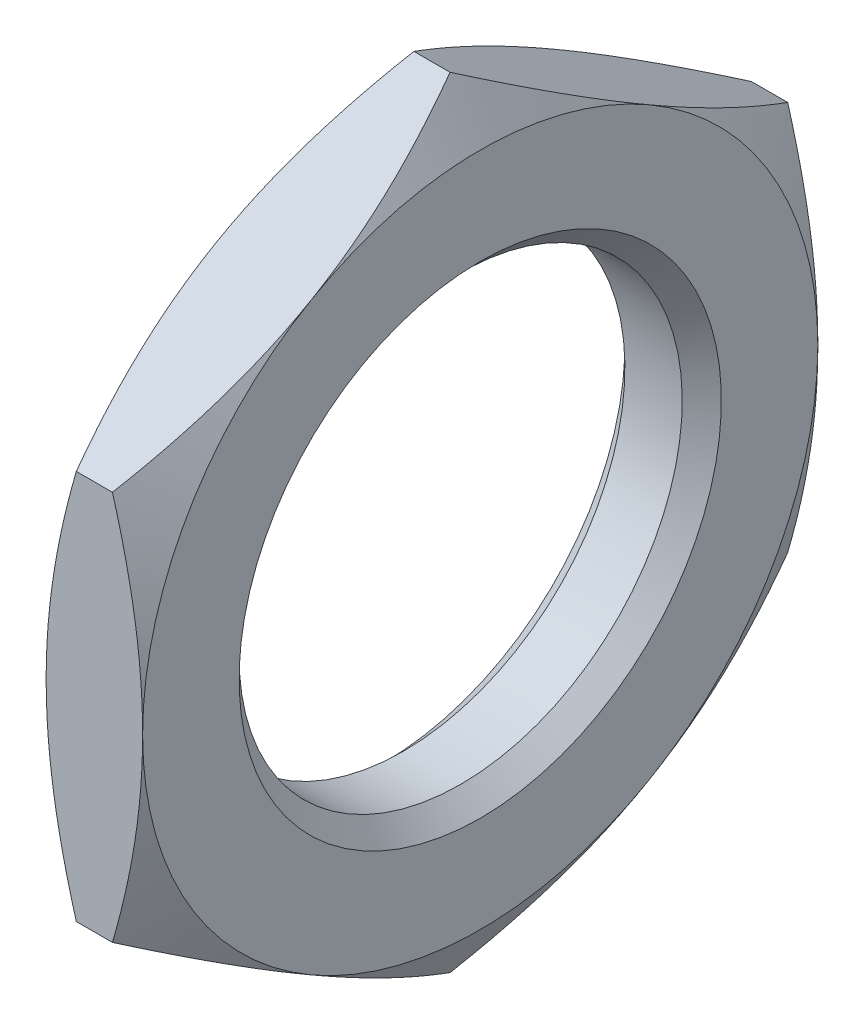
ISO-10303-21;
HEADER;
FILE_DESCRIPTION(('STEP AP214'),'2;1');
FILE_NAME('part.step','',(''),(''),'','','');
FILE_SCHEMA(('AUTOMOTIVE_DESIGN { 1 0 10303 214 1 1 1 1 }'));
ENDSEC;
DATA;
#1=APPLICATION_CONTEXT('core data for automotive mechanical design processes');
#2=APPLICATION_PROTOCOL_DEFINITION('international standard','automotive_design',2000,#1);
#3=PRODUCT_CONTEXT('',#1,'mechanical');
#4=PRODUCT('Part','Part','',(#3));
#5=PRODUCT_RELATED_PRODUCT_CATEGORY('part','',(#4));
#6=PRODUCT_DEFINITION_FORMATION('','',#4);
#7=PRODUCT_DEFINITION_CONTEXT('part definition',#1,'design');
#8=PRODUCT_DEFINITION('design','',#6,#7);
#9=PRODUCT_DEFINITION_SHAPE('','',#8);
#10=(LENGTH_UNIT() NAMED_UNIT(*) SI_UNIT(.MILLI.,.METRE.));
#11=(NAMED_UNIT(*) PLANE_ANGLE_UNIT() SI_UNIT($,.RADIAN.));
#12=(NAMED_UNIT(*) SI_UNIT($,.STERADIAN.) SOLID_ANGLE_UNIT());
#13=UNCERTAINTY_MEASURE_WITH_UNIT(LENGTH_MEASURE(1.E-05),#10,'distance_accuracy_value','');
#14=(GEOMETRIC_REPRESENTATION_CONTEXT(3) GLOBAL_UNCERTAINTY_ASSIGNED_CONTEXT((#13)) GLOBAL_UNIT_ASSIGNED_CONTEXT((#10,
#11,#12)) REPRESENTATION_CONTEXT('',''));
#15=CARTESIAN_POINT('',(0.,0.,0.));
#16=DIRECTION('',(0.,0.,1.));
#17=DIRECTION('',(1.,0.,0.));
#18=AXIS2_PLACEMENT_3D('',#15,#16,#17);
#19=CARTESIAN_POINT('',(-1.,-6.06217782649107,-3.5));
#20=DIRECTION('',(0.,-0.866025403784439,-0.5));
#21=DIRECTION('',(0.,0.5,-0.866025403784439));
#22=AXIS2_PLACEMENT_3D('',#19,#20,#21);
#23=PLANE('',#22);
#24=CARTESIAN_POINT('',(0.626425042070744,-4.03935646759652,-7.00362936824088));
#25=CARTESIAN_POINT('',(0.,-5.1235136228277,-5.12581409199112));
#26=CARTESIAN_POINT('',(0.,-6.06217782649107,-3.5));
#27=CARTESIAN_POINT('',(0.,-7.00084203015444,-1.87418590800888));
#28=CARTESIAN_POINT('',(0.626425042070745,-8.08499918538562,0.00362936824088389));
#29=(BOUNDED_CURVE() B_SPLINE_CURVE(2,(#24,#25,#26,#27,#28),.UNSPECIFIED.,.F.,
.F.) B_SPLINE_CURVE_WITH_KNOTS((3,2,3),(0.,4.10432147825994,8.20864295651988),
.UNSPECIFIED.) CURVE() GEOMETRIC_REPRESENTATION_ITEM() RATIONAL_B_SPLINE_CURVE((1.,
1.03802697460134,1.,1.03802697460135,1.)) REPRESENTATION_ITEM(''));
#30=CARTESIAN_POINT('',(0.625214782339285,-4.04145188432738,-7.));
#31=VERTEX_POINT('',#30);
#32=CARTESIAN_POINT('',(0.,-6.06217782649107,-3.5));
#33=VERTEX_POINT('',#32);
#34=EDGE_CURVE('E195',#31,#33,#29,.T.);
#35=ORIENTED_EDGE('',*,*,#34,.F.);
#36=DIRECTION('',(1.,0.,0.));
#37=VECTOR('',#36,1.);
#38=CARTESIAN_POINT('',(-1.,-4.04145188432738,-7.));
#39=LINE('',#38,#37);
#40=CARTESIAN_POINT('',(1.37478521766071,-4.04145188432738,-7.));
#41=VERTEX_POINT('',#40);
#42=EDGE_CURVE('E11',#31,#41,#39,.T.);
#43=ORIENTED_EDGE('',*,*,#42,.T.);
#44=CARTESIAN_POINT('',(1.37357495792926,-8.08499918538562,0.00362936824088389));
#45=CARTESIAN_POINT('',(2.,-7.00084203015444,-1.87418590800888));
#46=CARTESIAN_POINT('',(2.,-6.06217782649107,-3.5));
#47=CARTESIAN_POINT('',(2.,-5.12351362282771,-5.12581409199112));
#48=CARTESIAN_POINT('',(1.37357495792926,-4.03935646759652,-7.00362936824088));
#49=(BOUNDED_CURVE() B_SPLINE_CURVE(2,(#44,#45,#46,#47,#48),.UNSPECIFIED.,.F.,
.F.) B_SPLINE_CURVE_WITH_KNOTS((3,2,3),(0.,4.10432147825994,8.20864295651988),
.UNSPECIFIED.) CURVE() GEOMETRIC_REPRESENTATION_ITEM() RATIONAL_B_SPLINE_CURVE((1.,
1.03802697460135,1.,1.03802697460134,1.)) REPRESENTATION_ITEM(''));
#50=CARTESIAN_POINT('',(2.,-6.06217782649107,-3.5));
#51=VERTEX_POINT('',#50);
#52=EDGE_CURVE('E132',#51,#41,#49,.T.);
#53=ORIENTED_EDGE('',*,*,#52,.F.);
#54=CARTESIAN_POINT('',(1.37357495792926,-8.08499918538562,0.00362936824088389));
#55=CARTESIAN_POINT('',(2.,-7.00084203015444,-1.87418590800888));
#56=CARTESIAN_POINT('',(2.,-6.06217782649107,-3.5));
#57=CARTESIAN_POINT('',(2.,-5.12351362282771,-5.12581409199112));
#58=CARTESIAN_POINT('',(1.37357495792926,-4.03935646759652,-7.00362936824088));
#59=(BOUNDED_CURVE() B_SPLINE_CURVE(2,(#54,#55,#56,#57,#58),.UNSPECIFIED.,.F.,
.F.) B_SPLINE_CURVE_WITH_KNOTS((3,2,3),(0.,4.10432147825994,8.20864295651988),
.UNSPECIFIED.) CURVE() GEOMETRIC_REPRESENTATION_ITEM() RATIONAL_B_SPLINE_CURVE((1.,
1.03802697460135,1.,1.03802697460134,1.)) REPRESENTATION_ITEM(''));
#60=CARTESIAN_POINT('',(1.37478521766071,-8.08290376865476,0.));
#61=VERTEX_POINT('',#60);
#62=EDGE_CURVE('E156',#61,#51,#59,.T.);
#63=ORIENTED_EDGE('',*,*,#62,.F.);
#64=DIRECTION('',(1.,0.,0.));
#65=VECTOR('',#64,1.);
#66=CARTESIAN_POINT('',(-1.,-8.08290376865476,0.));
#67=LINE('',#66,#65);
#68=CARTESIAN_POINT('',(0.625214782339286,-8.08290376865476,0.));
#69=VERTEX_POINT('',#68);
#70=EDGE_CURVE('E152',#69,#61,#67,.T.);
#71=ORIENTED_EDGE('',*,*,#70,.F.);
#72=CARTESIAN_POINT('',(0.626425042070744,-4.03935646759652,-7.00362936824088));
#73=CARTESIAN_POINT('',(0.,-5.1235136228277,-5.12581409199112));
#74=CARTESIAN_POINT('',(0.,-6.06217782649107,-3.5));
#75=CARTESIAN_POINT('',(0.,-7.00084203015444,-1.87418590800888));
#76=CARTESIAN_POINT('',(0.626425042070745,-8.08499918538562,0.00362936824088389));
#77=(BOUNDED_CURVE() B_SPLINE_CURVE(2,(#72,#73,#74,#75,#76),.UNSPECIFIED.,.F.,
.F.) B_SPLINE_CURVE_WITH_KNOTS((3,2,3),(0.,4.10432147825994,8.20864295651988),
.UNSPECIFIED.) CURVE() GEOMETRIC_REPRESENTATION_ITEM() RATIONAL_B_SPLINE_CURVE((1.,
1.03802697460134,1.,1.03802697460135,1.)) REPRESENTATION_ITEM(''));
#78=EDGE_CURVE('E205',#33,#69,#77,.T.);
#79=ORIENTED_EDGE('',*,*,#78,.F.);
#80=EDGE_LOOP('',(#35,#43,#53,#63,#71,#79));
#81=FACE_BOUND('',#80,.T.);
#82=ADVANCED_FACE('F16',(#81),#23,.T.);
#83=CARTESIAN_POINT('',(-1.,0.,-7.));
#84=DIRECTION('',(0.,0.,-1.));
#85=DIRECTION('',(0.,1.,0.));
#86=AXIS2_PLACEMENT_3D('',#83,#84,#85);
#87=PLANE('',#86);
#88=CARTESIAN_POINT('',(0.626425042070744,4.04564271778911,-7.));
#89=CARTESIAN_POINT('',(0.,1.87732840732673,-7.));
#90=CARTESIAN_POINT('',(0.,0.,-7.));
#91=CARTESIAN_POINT('',(0.,-1.87732840732673,-7.));
#92=CARTESIAN_POINT('',(0.626425042070744,-4.04564271778911,-7.));
#93=(BOUNDED_CURVE() B_SPLINE_CURVE(2,(#88,#89,#90,#91,#92),.UNSPECIFIED.,.F.,
.F.) B_SPLINE_CURVE_WITH_KNOTS((3,2,3),(0.,4.10432147825995,8.20864295651989),
.UNSPECIFIED.) CURVE() GEOMETRIC_REPRESENTATION_ITEM() RATIONAL_B_SPLINE_CURVE((1.,
1.03802697460135,1.,1.03802697460135,1.)) REPRESENTATION_ITEM(''));
#94=CARTESIAN_POINT('',(0.625214782339284,4.04145188432738,-7.));
#95=VERTEX_POINT('',#94);
#96=CARTESIAN_POINT('',(0.,0.,-7.));
#97=VERTEX_POINT('',#96);
#98=EDGE_CURVE('E186',#95,#97,#93,.T.);
#99=ORIENTED_EDGE('',*,*,#98,.F.);
#100=DIRECTION('',(1.,0.,0.));
#101=VECTOR('',#100,1.);
#102=CARTESIAN_POINT('',(-1.,4.04145188432738,-7.));
#103=LINE('',#102,#101);
#104=CARTESIAN_POINT('',(1.37478521766072,4.04145188432738,-7.));
#105=VERTEX_POINT('',#104);
#106=EDGE_CURVE('E26',#95,#105,#103,.T.);
#107=ORIENTED_EDGE('',*,*,#106,.T.);
#108=CARTESIAN_POINT('',(1.37357495792926,-4.04564271778911,-7.));
#109=CARTESIAN_POINT('',(2.,-1.87732840732674,-7.));
#110=CARTESIAN_POINT('',(2.,0.,-7.));
#111=CARTESIAN_POINT('',(2.,1.87732840732674,-7.));
#112=CARTESIAN_POINT('',(1.37357495792926,4.04564271778911,-7.));
#113=(BOUNDED_CURVE() B_SPLINE_CURVE(2,(#108,#109,#110,#111,#112),.UNSPECIFIED.,.F.,
.F.) B_SPLINE_CURVE_WITH_KNOTS((3,2,3),(0.,4.10432147825995,8.20864295651989),
.UNSPECIFIED.) CURVE() GEOMETRIC_REPRESENTATION_ITEM() RATIONAL_B_SPLINE_CURVE((1.,
1.03802697460134,1.,1.03802697460134,1.)) REPRESENTATION_ITEM(''));
#114=CARTESIAN_POINT('',(2.,0.,-7.));
#115=VERTEX_POINT('',#114);
#116=EDGE_CURVE('E136',#115,#105,#113,.T.);
#117=ORIENTED_EDGE('',*,*,#116,.F.);
#118=CARTESIAN_POINT('',(1.37357495792926,-4.04564271778911,-7.));
#119=CARTESIAN_POINT('',(2.,-1.87732840732674,-7.));
#120=CARTESIAN_POINT('',(2.,0.,-7.));
#121=CARTESIAN_POINT('',(2.,1.87732840732674,-7.));
#122=CARTESIAN_POINT('',(1.37357495792926,4.04564271778911,-7.));
#123=(BOUNDED_CURVE() B_SPLINE_CURVE(2,(#118,#119,#120,#121,#122),.UNSPECIFIED.,.F.,
.F.) B_SPLINE_CURVE_WITH_KNOTS((3,2,3),(0.,4.10432147825995,8.20864295651989),
.UNSPECIFIED.) CURVE() GEOMETRIC_REPRESENTATION_ITEM() RATIONAL_B_SPLINE_CURVE((1.,
1.03802697460134,1.,1.03802697460134,1.)) REPRESENTATION_ITEM(''));
#124=EDGE_CURVE('E127',#41,#115,#123,.T.);
#125=ORIENTED_EDGE('',*,*,#124,.F.);
#126=ORIENTED_EDGE('',*,*,#42,.F.);
#127=CARTESIAN_POINT('',(0.626425042070744,4.04564271778911,-7.));
#128=CARTESIAN_POINT('',(0.,1.87732840732673,-7.));
#129=CARTESIAN_POINT('',(0.,0.,-7.));
#130=CARTESIAN_POINT('',(0.,-1.87732840732673,-7.));
#131=CARTESIAN_POINT('',(0.626425042070744,-4.04564271778911,-7.));
#132=(BOUNDED_CURVE() B_SPLINE_CURVE(2,(#127,#128,#129,#130,#131),.UNSPECIFIED.,.F.,
.F.) B_SPLINE_CURVE_WITH_KNOTS((3,2,3),(0.,4.10432147825995,8.20864295651989),
.UNSPECIFIED.) CURVE() GEOMETRIC_REPRESENTATION_ITEM() RATIONAL_B_SPLINE_CURVE((1.,
1.03802697460135,1.,1.03802697460135,1.)) REPRESENTATION_ITEM(''));
#133=EDGE_CURVE('E187',#97,#31,#132,.T.);
#134=ORIENTED_EDGE('',*,*,#133,.F.);
#135=EDGE_LOOP('',(#99,#107,#117,#125,#126,#134));
#136=FACE_BOUND('',#135,.T.);
#137=ADVANCED_FACE('F138',(#136),#87,.T.);
#138=CARTESIAN_POINT('',(-1.,6.06217782649107,-3.5));
#139=DIRECTION('',(0.,0.866025403784439,-0.5));
#140=DIRECTION('',(0.,0.5,0.866025403784439));
#141=AXIS2_PLACEMENT_3D('',#138,#139,#140);
#142=PLANE('',#141);
#143=CARTESIAN_POINT('',(0.626425042070744,8.08499918538562,0.00362936824088104));
#144=CARTESIAN_POINT('',(0.,7.00084203015444,-1.87418590800888));
#145=CARTESIAN_POINT('',(0.,6.06217782649107,-3.5));
#146=CARTESIAN_POINT('',(0.,5.1235136228277,-5.12581409199113));
#147=CARTESIAN_POINT('',(0.626425042070744,4.03935646759652,-7.00362936824089));
#148=(BOUNDED_CURVE() B_SPLINE_CURVE(2,(#143,#144,#145,#146,#147),.UNSPECIFIED.,.F.,
.F.) B_SPLINE_CURVE_WITH_KNOTS((3,2,3),(0.,4.10432147825994,8.20864295651988),
.UNSPECIFIED.) CURVE() GEOMETRIC_REPRESENTATION_ITEM() RATIONAL_B_SPLINE_CURVE((1.,
1.03802697460134,1.,1.03802697460133,1.)) REPRESENTATION_ITEM(''));
#149=CARTESIAN_POINT('',(0.625214782339285,8.08290376865476,0.));
#150=VERTEX_POINT('',#149);
#151=CARTESIAN_POINT('',(0.,6.06217782649107,-3.5));
#152=VERTEX_POINT('',#151);
#153=EDGE_CURVE('E180',#150,#152,#148,.T.);
#154=ORIENTED_EDGE('',*,*,#153,.F.);
#155=DIRECTION('',(1.,0.,0.));
#156=VECTOR('',#155,1.);
#157=CARTESIAN_POINT('',(-1.,8.08290376865476,0.));
#158=LINE('',#157,#156);
#159=CARTESIAN_POINT('',(1.37478521766071,8.08290376865476,0.));
#160=VERTEX_POINT('',#159);
#161=EDGE_CURVE('E150',#150,#160,#158,.T.);
#162=ORIENTED_EDGE('',*,*,#161,.T.);
#163=CARTESIAN_POINT('',(1.37357495792926,4.03935646759652,-7.00362936824088));
#164=CARTESIAN_POINT('',(2.,5.1235136228277,-5.12581409199112));
#165=CARTESIAN_POINT('',(2.,6.06217782649107,-3.5));
#166=CARTESIAN_POINT('',(2.,7.00084203015442,-1.87418590800887));
#167=CARTESIAN_POINT('',(1.37357495792926,8.08499918538562,0.00362936824088056));
#168=(BOUNDED_CURVE() B_SPLINE_CURVE(2,(#163,#164,#165,#166,#167),.UNSPECIFIED.,.F.,
.F.) B_SPLINE_CURVE_WITH_KNOTS((3,2,3),(0.,4.10432147825994,8.20864295651988),
.UNSPECIFIED.) CURVE() GEOMETRIC_REPRESENTATION_ITEM() RATIONAL_B_SPLINE_CURVE((1.,
1.03802697460133,1.,1.03802697460134,1.)) REPRESENTATION_ITEM(''));
#169=CARTESIAN_POINT('',(2.,6.06217782649107,-3.5));
#170=VERTEX_POINT('',#169);
#171=EDGE_CURVE('E349',#170,#160,#168,.T.);
#172=ORIENTED_EDGE('',*,*,#171,.F.);
#173=CARTESIAN_POINT('',(1.37357495792926,4.03935646759652,-7.00362936824088));
#174=CARTESIAN_POINT('',(2.,5.1235136228277,-5.12581409199112));
#175=CARTESIAN_POINT('',(2.,6.06217782649107,-3.5));
#176=CARTESIAN_POINT('',(2.,7.00084203015442,-1.87418590800887));
#177=CARTESIAN_POINT('',(1.37357495792926,8.08499918538562,0.00362936824088056));
#178=(BOUNDED_CURVE() B_SPLINE_CURVE(2,(#173,#174,#175,#176,#177),.UNSPECIFIED.,.F.,
.F.) B_SPLINE_CURVE_WITH_KNOTS((3,2,3),(0.,4.10432147825994,8.20864295651988),
.UNSPECIFIED.) CURVE() GEOMETRIC_REPRESENTATION_ITEM() RATIONAL_B_SPLINE_CURVE((1.,
1.03802697460133,1.,1.03802697460134,1.)) REPRESENTATION_ITEM(''));
#179=EDGE_CURVE('E144',#105,#170,#178,.T.);
#180=ORIENTED_EDGE('',*,*,#179,.F.);
#181=ORIENTED_EDGE('',*,*,#106,.F.);
#182=CARTESIAN_POINT('',(0.626425042070744,8.08499918538562,0.00362936824088104));
#183=CARTESIAN_POINT('',(0.,7.00084203015444,-1.87418590800888));
#184=CARTESIAN_POINT('',(0.,6.06217782649107,-3.5));
#185=CARTESIAN_POINT('',(0.,5.1235136228277,-5.12581409199113));
#186=CARTESIAN_POINT('',(0.626425042070744,4.03935646759652,-7.00362936824089));
#187=(BOUNDED_CURVE() B_SPLINE_CURVE(2,(#182,#183,#184,#185,#186),.UNSPECIFIED.,.F.,
.F.) B_SPLINE_CURVE_WITH_KNOTS((3,2,3),(0.,4.10432147825994,8.20864295651988),
.UNSPECIFIED.) CURVE() GEOMETRIC_REPRESENTATION_ITEM() RATIONAL_B_SPLINE_CURVE((1.,
1.03802697460134,1.,1.03802697460133,1.)) REPRESENTATION_ITEM(''));
#188=EDGE_CURVE('E181',#152,#95,#187,.T.);
#189=ORIENTED_EDGE('',*,*,#188,.F.);
#190=EDGE_LOOP('',(#154,#162,#172,#180,#181,#189));
#191=FACE_BOUND('',#190,.T.);
#192=ADVANCED_FACE('F291',(#191),#142,.T.);
#193=CARTESIAN_POINT('',(-1.,-6.06217782649107,3.5));
#194=DIRECTION('',(0.,-0.866025403784439,0.5));
#195=DIRECTION('',(0.,-0.5,-0.866025403784439));
#196=AXIS2_PLACEMENT_3D('',#193,#194,#195);
#197=PLANE('',#196);
#198=CARTESIAN_POINT('',(0.626425042070745,-8.08499918538562,-0.00362936824088437));
#199=CARTESIAN_POINT('',(0.,-7.00084203015444,1.87418590800886));
#200=CARTESIAN_POINT('',(0.,-6.06217782649107,3.5));
#201=CARTESIAN_POINT('',(0.,-5.1235136228277,5.12581409199113));
#202=CARTESIAN_POINT('',(0.626425042070744,-4.03935646759652,7.00362936824088));
#203=(BOUNDED_CURVE() B_SPLINE_CURVE(2,(#198,#199,#200,#201,#202),.UNSPECIFIED.,.F.,
.F.) B_SPLINE_CURVE_WITH_KNOTS((3,2,3),(0.,4.10432147825994,8.20864295651988),
.UNSPECIFIED.) CURVE() GEOMETRIC_REPRESENTATION_ITEM() RATIONAL_B_SPLINE_CURVE((1.,
1.03802697460134,1.,1.03802697460133,1.)) REPRESENTATION_ITEM(''));
#204=CARTESIAN_POINT('',(0.,-6.06217782649107,3.5));
#205=VERTEX_POINT('',#204);
#206=CARTESIAN_POINT('',(0.625214782339285,-4.04145188432738,7.));
#207=VERTEX_POINT('',#206);
#208=EDGE_CURVE('E163',#205,#207,#203,.T.);
#209=ORIENTED_EDGE('',*,*,#208,.F.);
#210=CARTESIAN_POINT('',(0.626425042070745,-8.08499918538562,-0.00362936824088437));
#211=CARTESIAN_POINT('',(0.,-7.00084203015444,1.87418590800886));
#212=CARTESIAN_POINT('',(0.,-6.06217782649107,3.5));
#213=CARTESIAN_POINT('',(0.,-5.1235136228277,5.12581409199113));
#214=CARTESIAN_POINT('',(0.626425042070744,-4.03935646759652,7.00362936824088));
#215=(BOUNDED_CURVE() B_SPLINE_CURVE(2,(#210,#211,#212,#213,#214),.UNSPECIFIED.,.F.,
.F.) B_SPLINE_CURVE_WITH_KNOTS((3,2,3),(0.,4.10432147825994,8.20864295651988),
.UNSPECIFIED.) CURVE() GEOMETRIC_REPRESENTATION_ITEM() RATIONAL_B_SPLINE_CURVE((1.,
1.03802697460134,1.,1.03802697460133,1.)) REPRESENTATION_ITEM(''));
#216=EDGE_CURVE('E197',#69,#205,#215,.T.);
#217=ORIENTED_EDGE('',*,*,#216,.F.);
#218=ORIENTED_EDGE('',*,*,#70,.T.);
#219=CARTESIAN_POINT('',(1.37357495792926,-4.03935646759652,7.00362936824089));
#220=CARTESIAN_POINT('',(2.,-5.12351362282771,5.12581409199113));
#221=CARTESIAN_POINT('',(2.,-6.06217782649107,3.5));
#222=CARTESIAN_POINT('',(2.,-7.00084203015443,1.87418590800887));
#223=CARTESIAN_POINT('',(1.37357495792926,-8.08499918538562,-0.00362936824088533));
#224=(BOUNDED_CURVE() B_SPLINE_CURVE(2,(#219,#220,#221,#222,#223),.UNSPECIFIED.,.F.,
.F.) B_SPLINE_CURVE_WITH_KNOTS((3,2,3),(0.,4.10432147825995,8.20864295651989),
.UNSPECIFIED.) CURVE() GEOMETRIC_REPRESENTATION_ITEM() RATIONAL_B_SPLINE_CURVE((1.,
1.03802697460134,1.,1.03802697460134,1.)) REPRESENTATION_ITEM(''));
#225=CARTESIAN_POINT('',(2.,-6.06217782649107,3.5));
#226=VERTEX_POINT('',#225);
#227=EDGE_CURVE('E249',#226,#61,#224,.T.);
#228=ORIENTED_EDGE('',*,*,#227,.F.);
#229=CARTESIAN_POINT('',(1.37357495792926,-4.03935646759652,7.00362936824089));
#230=CARTESIAN_POINT('',(2.,-5.12351362282771,5.12581409199113));
#231=CARTESIAN_POINT('',(2.,-6.06217782649107,3.5));
#232=CARTESIAN_POINT('',(2.,-7.00084203015443,1.87418590800887));
#233=CARTESIAN_POINT('',(1.37357495792926,-8.08499918538562,-0.00362936824088533));
#234=(BOUNDED_CURVE() B_SPLINE_CURVE(2,(#229,#230,#231,#232,#233),.UNSPECIFIED.,.F.,
.F.) B_SPLINE_CURVE_WITH_KNOTS((3,2,3),(0.,4.10432147825995,8.20864295651989),
.UNSPECIFIED.) CURVE() GEOMETRIC_REPRESENTATION_ITEM() RATIONAL_B_SPLINE_CURVE((1.,
1.03802697460134,1.,1.03802697460134,1.)) REPRESENTATION_ITEM(''));
#235=CARTESIAN_POINT('',(1.37478521766071,-4.04145188432738,7.));
#236=VERTEX_POINT('',#235);
#237=EDGE_CURVE('E221',#236,#226,#234,.T.);
#238=ORIENTED_EDGE('',*,*,#237,.F.);
#239=DIRECTION('',(1.,0.,0.));
#240=VECTOR('',#239,1.);
#241=CARTESIAN_POINT('',(-1.,-4.04145188432738,7.));
#242=LINE('',#241,#240);
#243=EDGE_CURVE('E154',#207,#236,#242,.T.);
#244=ORIENTED_EDGE('',*,*,#243,.F.);
#245=EDGE_LOOP('',(#209,#217,#218,#228,#238,#244));
#246=FACE_BOUND('',#245,.T.);
#247=ADVANCED_FACE('F393',(#246),#197,.T.);
#248=CARTESIAN_POINT('',(-1.,0.,7.));
#249=DIRECTION('',(0.,0.,1.));
#250=DIRECTION('',(0.,-1.,0.));
#251=AXIS2_PLACEMENT_3D('',#248,#249,#250);
#252=PLANE('',#251);
#253=CARTESIAN_POINT('',(0.626425042070744,-4.04564271778911,7.));
#254=CARTESIAN_POINT('',(0.,-1.87732840732673,7.));
#255=CARTESIAN_POINT('',(0.,0.,7.));
#256=CARTESIAN_POINT('',(0.,1.87732840732673,6.99999999999999));
#257=CARTESIAN_POINT('',(0.626425042070744,4.04564271778911,7.));
#258=(BOUNDED_CURVE() B_SPLINE_CURVE(2,(#253,#254,#255,#256,#257),.UNSPECIFIED.,.F.,
.F.) B_SPLINE_CURVE_WITH_KNOTS((3,2,3),(0.,4.10432147825995,8.20864295651989),
.UNSPECIFIED.) CURVE() GEOMETRIC_REPRESENTATION_ITEM() RATIONAL_B_SPLINE_CURVE((1.,
1.03802697460134,1.,1.03802697460136,1.)) REPRESENTATION_ITEM(''));
#259=CARTESIAN_POINT('',(0.,0.,7.));
#260=VERTEX_POINT('',#259);
#261=CARTESIAN_POINT('',(0.625214782339285,4.04145188432738,7.));
#262=VERTEX_POINT('',#261);
#263=EDGE_CURVE('E268',#260,#262,#258,.T.);
#264=ORIENTED_EDGE('',*,*,#263,.F.);
#265=CARTESIAN_POINT('',(0.626425042070744,-4.04564271778911,7.));
#266=CARTESIAN_POINT('',(0.,-1.87732840732673,7.));
#267=CARTESIAN_POINT('',(0.,0.,7.));
#268=CARTESIAN_POINT('',(0.,1.87732840732673,6.99999999999999));
#269=CARTESIAN_POINT('',(0.626425042070744,4.04564271778911,7.));
#270=(BOUNDED_CURVE() B_SPLINE_CURVE(2,(#265,#266,#267,#268,#269),.UNSPECIFIED.,.F.,
.F.) B_SPLINE_CURVE_WITH_KNOTS((3,2,3),(0.,4.10432147825995,8.20864295651989),
.UNSPECIFIED.) CURVE() GEOMETRIC_REPRESENTATION_ITEM() RATIONAL_B_SPLINE_CURVE((1.,
1.03802697460134,1.,1.03802697460136,1.)) REPRESENTATION_ITEM(''));
#271=EDGE_CURVE('E164',#207,#260,#270,.T.);
#272=ORIENTED_EDGE('',*,*,#271,.F.);
#273=ORIENTED_EDGE('',*,*,#243,.T.);
#274=CARTESIAN_POINT('',(1.37357495792926,4.04564271778911,7.));
#275=CARTESIAN_POINT('',(2.,1.87732840732674,7.));
#276=CARTESIAN_POINT('',(2.,0.,7.));
#277=CARTESIAN_POINT('',(2.,-1.87732840732674,7.));
#278=CARTESIAN_POINT('',(1.37357495792926,-4.04564271778911,7.));
#279=(BOUNDED_CURVE() B_SPLINE_CURVE(2,(#274,#275,#276,#277,#278),.UNSPECIFIED.,.F.,
.F.) B_SPLINE_CURVE_WITH_KNOTS((3,2,3),(0.,4.10432147825995,8.20864295651989),
.UNSPECIFIED.) CURVE() GEOMETRIC_REPRESENTATION_ITEM() RATIONAL_B_SPLINE_CURVE((1.,
1.03802697460135,1.,1.03802697460135,1.)) REPRESENTATION_ITEM(''));
#280=CARTESIAN_POINT('',(2.,0.,7.));
#281=VERTEX_POINT('',#280);
#282=EDGE_CURVE('E213',#281,#236,#279,.T.);
#283=ORIENTED_EDGE('',*,*,#282,.F.);
#284=CARTESIAN_POINT('',(1.37357495792926,4.04564271778911,7.));
#285=CARTESIAN_POINT('',(2.,1.87732840732674,7.));
#286=CARTESIAN_POINT('',(2.,0.,7.));
#287=CARTESIAN_POINT('',(2.,-1.87732840732674,7.));
#288=CARTESIAN_POINT('',(1.37357495792926,-4.04564271778911,7.));
#289=(BOUNDED_CURVE() B_SPLINE_CURVE(2,(#284,#285,#286,#287,#288),.UNSPECIFIED.,.F.,
.F.) B_SPLINE_CURVE_WITH_KNOTS((3,2,3),(0.,4.10432147825995,8.20864295651989),
.UNSPECIFIED.) CURVE() GEOMETRIC_REPRESENTATION_ITEM() RATIONAL_B_SPLINE_CURVE((1.,
1.03802697460135,1.,1.03802697460135,1.)) REPRESENTATION_ITEM(''));
#290=CARTESIAN_POINT('',(1.37478521766071,4.04145188432738,7.));
#291=VERTEX_POINT('',#290);
#292=EDGE_CURVE('E355',#291,#281,#289,.T.);
#293=ORIENTED_EDGE('',*,*,#292,.F.);
#294=DIRECTION('',(1.,0.,0.));
#295=VECTOR('',#294,1.);
#296=CARTESIAN_POINT('',(-1.,4.04145188432738,7.));
#297=LINE('',#296,#295);
#298=EDGE_CURVE('E273',#262,#291,#297,.T.);
#299=ORIENTED_EDGE('',*,*,#298,.F.);
#300=EDGE_LOOP('',(#264,#272,#273,#283,#293,#299));
#301=FACE_BOUND('',#300,.T.);
#302=ADVANCED_FACE('F399',(#301),#252,.T.);
#303=CARTESIAN_POINT('',(-1.,6.06217782649107,3.5));
#304=DIRECTION('',(0.,0.866025403784439,0.5));
#305=DIRECTION('',(0.,-0.5,0.866025403784439));
#306=AXIS2_PLACEMENT_3D('',#303,#304,#305);
#307=PLANE('',#306);
#308=CARTESIAN_POINT('',(0.626425042070743,4.03935646759652,7.00362936824088));
#309=CARTESIAN_POINT('',(0.,5.12351362282771,5.12581409199113));
#310=CARTESIAN_POINT('',(0.,6.06217782649107,3.5));
#311=CARTESIAN_POINT('',(0.,7.00084203015443,1.87418590800887));
#312=CARTESIAN_POINT('',(0.626425042070743,8.08499918538562,-0.00362936824088913));
#313=(BOUNDED_CURVE() B_SPLINE_CURVE(2,(#308,#309,#310,#311,#312),.UNSPECIFIED.,.F.,
.F.) B_SPLINE_CURVE_WITH_KNOTS((3,2,3),(0.,4.10432147825995,8.20864295651989),
.UNSPECIFIED.) CURVE() GEOMETRIC_REPRESENTATION_ITEM() RATIONAL_B_SPLINE_CURVE((1.,
1.03802697460134,1.,1.03802697460134,1.)) REPRESENTATION_ITEM(''));
#314=CARTESIAN_POINT('',(0.,6.06217782649107,3.5));
#315=VERTEX_POINT('',#314);
#316=EDGE_CURVE('E179',#315,#150,#313,.T.);
#317=ORIENTED_EDGE('',*,*,#316,.F.);
#318=CARTESIAN_POINT('',(0.626425042070743,4.03935646759652,7.00362936824088));
#319=CARTESIAN_POINT('',(0.,5.12351362282771,5.12581409199113));
#320=CARTESIAN_POINT('',(0.,6.06217782649107,3.5));
#321=CARTESIAN_POINT('',(0.,7.00084203015443,1.87418590800887));
#322=CARTESIAN_POINT('',(0.626425042070743,8.08499918538562,-0.00362936824088913));
#323=(BOUNDED_CURVE() B_SPLINE_CURVE(2,(#318,#319,#320,#321,#322),.UNSPECIFIED.,.F.,
.F.) B_SPLINE_CURVE_WITH_KNOTS((3,2,3),(0.,4.10432147825995,8.20864295651989),
.UNSPECIFIED.) CURVE() GEOMETRIC_REPRESENTATION_ITEM() RATIONAL_B_SPLINE_CURVE((1.,
1.03802697460134,1.,1.03802697460134,1.)) REPRESENTATION_ITEM(''));
#324=EDGE_CURVE('E157',#262,#315,#323,.T.);
#325=ORIENTED_EDGE('',*,*,#324,.F.);
#326=ORIENTED_EDGE('',*,*,#298,.T.);
#327=CARTESIAN_POINT('',(1.37357495792925,8.08499918538562,-0.00362936824088865));
#328=CARTESIAN_POINT('',(2.,7.00084203015443,1.87418590800888));
#329=CARTESIAN_POINT('',(2.,6.06217782649107,3.5));
#330=CARTESIAN_POINT('',(2.,5.1235136228277,5.12581409199112));
#331=CARTESIAN_POINT('',(1.37357495792926,4.03935646759652,7.00362936824088));
#332=(BOUNDED_CURVE() B_SPLINE_CURVE(2,(#327,#328,#329,#330,#331),.UNSPECIFIED.,.F.,
.F.) B_SPLINE_CURVE_WITH_KNOTS((3,2,3),(0.,4.10432147825995,8.20864295651989),
.UNSPECIFIED.) CURVE() GEOMETRIC_REPRESENTATION_ITEM() RATIONAL_B_SPLINE_CURVE((1.,
1.03802697460135,1.,1.03802697460135,1.)) REPRESENTATION_ITEM(''));
#333=CARTESIAN_POINT('',(2.,6.06217782649107,3.5));
#334=VERTEX_POINT('',#333);
#335=EDGE_CURVE('E206',#334,#291,#332,.T.);
#336=ORIENTED_EDGE('',*,*,#335,.F.);
#337=CARTESIAN_POINT('',(1.37357495792925,8.08499918538562,-0.00362936824088865));
#338=CARTESIAN_POINT('',(2.,7.00084203015443,1.87418590800888));
#339=CARTESIAN_POINT('',(2.,6.06217782649107,3.5));
#340=CARTESIAN_POINT('',(2.,5.1235136228277,5.12581409199112));
#341=CARTESIAN_POINT('',(1.37357495792926,4.03935646759652,7.00362936824088));
#342=(BOUNDED_CURVE() B_SPLINE_CURVE(2,(#337,#338,#339,#340,#341),.UNSPECIFIED.,.F.,
.F.) B_SPLINE_CURVE_WITH_KNOTS((3,2,3),(0.,4.10432147825995,8.20864295651989),
.UNSPECIFIED.) CURVE() GEOMETRIC_REPRESENTATION_ITEM() RATIONAL_B_SPLINE_CURVE((1.,
1.03802697460135,1.,1.03802697460135,1.)) REPRESENTATION_ITEM(''));
#343=EDGE_CURVE('E141',#160,#334,#342,.T.);
#344=ORIENTED_EDGE('',*,*,#343,.F.);
#345=ORIENTED_EDGE('',*,*,#161,.F.);
#346=EDGE_LOOP('',(#317,#325,#326,#336,#344,#345));
#347=FACE_BOUND('',#346,.T.);
#348=ADVANCED_FACE('F306',(#347),#307,.T.);
#349=CARTESIAN_POINT('',(0.,-6.,0.));
#350=DIRECTION('',(-1.,0.,0.));
#351=DIRECTION('',(0.,1.,0.));
#352=AXIS2_PLACEMENT_3D('',#349,#350,#351);
#353=PLANE('',#352);
#354=CARTESIAN_POINT('',(0.,0.,0.));
#355=DIRECTION('',(1.,0.,0.));
#356=DIRECTION('',(0.,-1.,0.));
#357=AXIS2_PLACEMENT_3D('',#354,#355,#356);
#358=CIRCLE('',#357,5.);
#359=CARTESIAN_POINT('',(0.,-5.,0.));
#360=VERTEX_POINT('',#359);
#361=EDGE_CURVE('E33',#360,#360,#358,.T.);
#362=ORIENTED_EDGE('',*,*,#361,.T.);
#363=EDGE_LOOP('',(#362));
#364=FACE_BOUND('',#363,.T.);
#365=CARTESIAN_POINT('',(0.,0.,0.));
#366=DIRECTION('',(1.,0.,0.));
#367=DIRECTION('',(0.,-1.,0.));
#368=AXIS2_PLACEMENT_3D('',#365,#366,#367);
#369=CIRCLE('',#368,7.);
#370=EDGE_CURVE('E146',#205,#33,#369,.T.);
#371=ORIENTED_EDGE('',*,*,#370,.F.);
#372=CARTESIAN_POINT('',(0.,0.,0.));
#373=DIRECTION('',(1.,0.,0.));
#374=DIRECTION('',(0.,-1.,0.));
#375=AXIS2_PLACEMENT_3D('',#372,#373,#374);
#376=CIRCLE('',#375,7.);
#377=EDGE_CURVE('E172',#260,#205,#376,.T.);
#378=ORIENTED_EDGE('',*,*,#377,.F.);
#379=CARTESIAN_POINT('',(0.,0.,0.));
#380=DIRECTION('',(1.,0.,0.));
#381=DIRECTION('',(0.,-1.,0.));
#382=AXIS2_PLACEMENT_3D('',#379,#380,#381);
#383=CIRCLE('',#382,7.);
#384=EDGE_CURVE('E162',#315,#260,#383,.T.);
#385=ORIENTED_EDGE('',*,*,#384,.F.);
#386=CARTESIAN_POINT('',(0.,0.,0.));
#387=DIRECTION('',(1.,0.,0.));
#388=DIRECTION('',(0.,-1.,0.));
#389=AXIS2_PLACEMENT_3D('',#386,#387,#388);
#390=CIRCLE('',#389,7.);
#391=EDGE_CURVE('E173',#152,#315,#390,.T.);
#392=ORIENTED_EDGE('',*,*,#391,.F.);
#393=CARTESIAN_POINT('',(0.,0.,0.));
#394=DIRECTION('',(1.,0.,0.));
#395=DIRECTION('',(0.,-1.,0.));
#396=AXIS2_PLACEMENT_3D('',#393,#394,#395);
#397=CIRCLE('',#396,7.);
#398=EDGE_CURVE('E196',#97,#152,#397,.T.);
#399=ORIENTED_EDGE('',*,*,#398,.F.);
#400=CARTESIAN_POINT('',(0.,0.,0.));
#401=DIRECTION('',(1.,0.,0.));
#402=DIRECTION('',(0.,-1.,0.));
#403=AXIS2_PLACEMENT_3D('',#400,#401,#402);
#404=CIRCLE('',#403,7.);
#405=EDGE_CURVE('E263',#33,#97,#404,.T.);
#406=ORIENTED_EDGE('',*,*,#405,.F.);
#407=EDGE_LOOP('',(#371,#378,#385,#392,#399,#406));
#408=FACE_BOUND('',#407,.T.);
#409=ADVANCED_FACE('F296',(#364,#408),#353,.T.);
#410=CARTESIAN_POINT('',(0.20296875,0.,0.));
#411=DIRECTION('',(-1.,0.,0.));
#412=DIRECTION('',(0.,-1.,0.));
#413=AXIS2_PLACEMENT_3D('',#410,#411,#412);
#414=CONICAL_SURFACE('',#413,4.79703125,0.785398163397448);
#415=CARTESIAN_POINT('',(0.4059375,0.,0.));
#416=DIRECTION('',(1.,0.,0.));
#417=DIRECTION('',(0.,-1.,0.));
#418=AXIS2_PLACEMENT_3D('',#415,#416,#417);
#419=CIRCLE('',#418,4.5940625);
#420=CARTESIAN_POINT('',(0.4059375,-4.5940625,0.));
#421=VERTEX_POINT('',#420);
#422=EDGE_CURVE('E20',#421,#421,#419,.T.);
#423=ORIENTED_EDGE('',*,*,#422,.T.);
#424=EDGE_LOOP('',(#423));
#425=FACE_BOUND('',#424,.T.);
#426=ORIENTED_EDGE('',*,*,#361,.F.);
#427=EDGE_LOOP('',(#426));
#428=FACE_BOUND('',#427,.T.);
#429=ADVANCED_FACE('F429',(#425,#428),#414,.F.);
#430=CARTESIAN_POINT('',(1.,0.,0.));
#431=DIRECTION('',(-1.,0.,0.));
#432=DIRECTION('',(0.,-1.,0.));
#433=AXIS2_PLACEMENT_3D('',#430,#431,#432);
#434=CYLINDRICAL_SURFACE('',#433,4.5940625);
#435=CARTESIAN_POINT('',(1.5940625,0.,0.));
#436=DIRECTION('',(1.,0.,0.));
#437=DIRECTION('',(0.,-1.,0.));
#438=AXIS2_PLACEMENT_3D('',#435,#436,#437);
#439=CIRCLE('',#438,4.5940625);
#440=CARTESIAN_POINT('',(1.5940625,-4.5940625,0.));
#441=VERTEX_POINT('',#440);
#442=EDGE_CURVE('E327',#441,#441,#439,.T.);
#443=ORIENTED_EDGE('',*,*,#442,.T.);
#444=EDGE_LOOP('',(#443));
#445=FACE_BOUND('',#444,.T.);
#446=ORIENTED_EDGE('',*,*,#422,.F.);
#447=EDGE_LOOP('',(#446));
#448=FACE_BOUND('',#447,.T.);
#449=ADVANCED_FACE('F431',(#445,#448),#434,.F.);
#450=CARTESIAN_POINT('',(1.79703125,0.,0.));
#451=DIRECTION('',(1.,0.,0.));
#452=DIRECTION('',(0.,-1.,0.));
#453=AXIS2_PLACEMENT_3D('',#450,#451,#452);
#454=CONICAL_SURFACE('',#453,4.79703125,0.785398163397448);
#455=CARTESIAN_POINT('',(2.,0.,0.));
#456=DIRECTION('',(1.,0.,0.));
#457=DIRECTION('',(0.,-1.,0.));
#458=AXIS2_PLACEMENT_3D('',#455,#456,#457);
#459=CIRCLE('',#458,5.);
#460=CARTESIAN_POINT('',(2.,-5.,0.));
#461=VERTEX_POINT('',#460);
#462=EDGE_CURVE('E126',#461,#461,#459,.T.);
#463=ORIENTED_EDGE('',*,*,#462,.T.);
#464=EDGE_LOOP('',(#463));
#465=FACE_BOUND('',#464,.T.);
#466=ORIENTED_EDGE('',*,*,#442,.F.);
#467=EDGE_LOOP('',(#466));
#468=FACE_BOUND('',#467,.T.);
#469=ADVANCED_FACE('F447',(#465,#468),#454,.F.);
#470=CARTESIAN_POINT('',(2.,-6.,0.));
#471=DIRECTION('',(1.,0.,0.));
#472=DIRECTION('',(0.,-1.,0.));
#473=AXIS2_PLACEMENT_3D('',#470,#471,#472);
#474=PLANE('',#473);
#475=CARTESIAN_POINT('',(2.,0.,0.));
#476=DIRECTION('',(1.,0.,0.));
#477=DIRECTION('',(0.,-1.,0.));
#478=AXIS2_PLACEMENT_3D('',#475,#476,#477);
#479=CIRCLE('',#478,7.);
#480=EDGE_CURVE('E121',#226,#51,#479,.T.);
#481=ORIENTED_EDGE('',*,*,#480,.T.);
#482=CARTESIAN_POINT('',(2.,0.,0.));
#483=DIRECTION('',(1.,0.,0.));
#484=DIRECTION('',(0.,-1.,0.));
#485=AXIS2_PLACEMENT_3D('',#482,#483,#484);
#486=CIRCLE('',#485,7.);
#487=EDGE_CURVE('E112',#51,#115,#486,.T.);
#488=ORIENTED_EDGE('',*,*,#487,.T.);
#489=CARTESIAN_POINT('',(2.,0.,0.));
#490=DIRECTION('',(1.,0.,0.));
#491=DIRECTION('',(0.,-1.,0.));
#492=AXIS2_PLACEMENT_3D('',#489,#490,#491);
#493=CIRCLE('',#492,7.);
#494=EDGE_CURVE('E118',#115,#170,#493,.T.);
#495=ORIENTED_EDGE('',*,*,#494,.T.);
#496=CARTESIAN_POINT('',(2.,0.,0.));
#497=DIRECTION('',(1.,0.,0.));
#498=DIRECTION('',(0.,-1.,0.));
#499=AXIS2_PLACEMENT_3D('',#496,#497,#498);
#500=CIRCLE('',#499,7.);
#501=EDGE_CURVE('E335',#170,#334,#500,.T.);
#502=ORIENTED_EDGE('',*,*,#501,.T.);
#503=CARTESIAN_POINT('',(2.,0.,0.));
#504=DIRECTION('',(1.,0.,0.));
#505=DIRECTION('',(0.,-1.,0.));
#506=AXIS2_PLACEMENT_3D('',#503,#504,#505);
#507=CIRCLE('',#506,7.);
#508=EDGE_CURVE('E214',#334,#281,#507,.T.);
#509=ORIENTED_EDGE('',*,*,#508,.T.);
#510=CARTESIAN_POINT('',(2.,0.,0.));
#511=DIRECTION('',(1.,0.,0.));
#512=DIRECTION('',(0.,-1.,0.));
#513=AXIS2_PLACEMENT_3D('',#510,#511,#512);
#514=CIRCLE('',#513,7.);
#515=EDGE_CURVE('E229',#281,#226,#514,.T.);
#516=ORIENTED_EDGE('',*,*,#515,.T.);
#517=EDGE_LOOP('',(#481,#488,#495,#502,#509,#516));
#518=FACE_BOUND('',#517,.T.);
#519=ORIENTED_EDGE('',*,*,#462,.F.);
#520=EDGE_LOOP('',(#519));
#521=FACE_BOUND('',#520,.T.);
#522=ADVANCED_FACE('F114',(#518,#521),#474,.T.);
#523=CARTESIAN_POINT('',(1.68678747896463,0.,0.));
#524=DIRECTION('',(-1.,0.,0.));
#525=DIRECTION('',(0.,-1.,0.));
#526=AXIS2_PLACEMENT_3D('',#523,#524,#525);
#527=CONICAL_SURFACE('',#526,7.5425,1.0471975511966);
#528=ORIENTED_EDGE('',*,*,#52,.T.);
#529=ORIENTED_EDGE('',*,*,#124,.T.);
#530=ORIENTED_EDGE('',*,*,#487,.F.);
#531=EDGE_LOOP('',(#528,#529,#530));
#532=FACE_BOUND('',#531,.T.);
#533=ADVANCED_FACE('F131',(#532),#527,.T.);
#534=CARTESIAN_POINT('',(1.68678747896463,0.,0.));
#535=DIRECTION('',(-1.,0.,0.));
#536=DIRECTION('',(0.,-1.,0.));
#537=AXIS2_PLACEMENT_3D('',#534,#535,#536);
#538=CONICAL_SURFACE('',#537,7.5425,1.0471975511966);
#539=ORIENTED_EDGE('',*,*,#227,.T.);
#540=ORIENTED_EDGE('',*,*,#62,.T.);
#541=ORIENTED_EDGE('',*,*,#480,.F.);
#542=EDGE_LOOP('',(#539,#540,#541));
#543=FACE_BOUND('',#542,.T.);
#544=ADVANCED_FACE('F406',(#543),#538,.T.);
#545=CARTESIAN_POINT('',(1.68678747896463,0.,0.));
#546=DIRECTION('',(-1.,0.,0.));
#547=DIRECTION('',(0.,-1.,0.));
#548=AXIS2_PLACEMENT_3D('',#545,#546,#547);
#549=CONICAL_SURFACE('',#548,7.5425,1.0471975511966);
#550=ORIENTED_EDGE('',*,*,#282,.T.);
#551=ORIENTED_EDGE('',*,*,#237,.T.);
#552=ORIENTED_EDGE('',*,*,#515,.F.);
#553=EDGE_LOOP('',(#550,#551,#552));
#554=FACE_BOUND('',#553,.T.);
#555=ADVANCED_FACE('F402',(#554),#549,.T.);
#556=CARTESIAN_POINT('',(1.68678747896463,0.,0.));
#557=DIRECTION('',(-1.,0.,0.));
#558=DIRECTION('',(0.,-1.,0.));
#559=AXIS2_PLACEMENT_3D('',#556,#557,#558);
#560=CONICAL_SURFACE('',#559,7.5425,1.0471975511966);
#561=ORIENTED_EDGE('',*,*,#292,.T.);
#562=ORIENTED_EDGE('',*,*,#508,.F.);
#563=ORIENTED_EDGE('',*,*,#335,.T.);
#564=EDGE_LOOP('',(#561,#562,#563));
#565=FACE_BOUND('',#564,.T.);
#566=ADVANCED_FACE('F414',(#565),#560,.T.);
#567=CARTESIAN_POINT('',(1.68678747896463,0.,0.));
#568=DIRECTION('',(-1.,0.,0.));
#569=DIRECTION('',(0.,-1.,0.));
#570=AXIS2_PLACEMENT_3D('',#567,#568,#569);
#571=CONICAL_SURFACE('',#570,7.5425,1.0471975511966);
#572=ORIENTED_EDGE('',*,*,#343,.T.);
#573=ORIENTED_EDGE('',*,*,#501,.F.);
#574=ORIENTED_EDGE('',*,*,#171,.T.);
#575=EDGE_LOOP('',(#572,#573,#574));
#576=FACE_BOUND('',#575,.T.);
#577=ADVANCED_FACE('F437',(#576),#571,.T.);
#578=CARTESIAN_POINT('',(1.68678747896463,0.,0.));
#579=DIRECTION('',(-1.,0.,0.));
#580=DIRECTION('',(0.,-1.,0.));
#581=AXIS2_PLACEMENT_3D('',#578,#579,#580);
#582=CONICAL_SURFACE('',#581,7.5425,1.0471975511966);
#583=ORIENTED_EDGE('',*,*,#179,.T.);
#584=ORIENTED_EDGE('',*,*,#494,.F.);
#585=ORIENTED_EDGE('',*,*,#116,.T.);
#586=EDGE_LOOP('',(#583,#584,#585));
#587=FACE_BOUND('',#586,.T.);
#588=ADVANCED_FACE('F143',(#587),#582,.T.);
#589=CARTESIAN_POINT('',(0.313212521035372,0.,0.));
#590=DIRECTION('',(1.,0.,0.));
#591=DIRECTION('',(0.,-1.,0.));
#592=AXIS2_PLACEMENT_3D('',#589,#590,#591);
#593=CONICAL_SURFACE('',#592,7.5425,1.0471975511966);
#594=ORIENTED_EDGE('',*,*,#78,.T.);
#595=ORIENTED_EDGE('',*,*,#216,.T.);
#596=ORIENTED_EDGE('',*,*,#370,.T.);
#597=EDGE_LOOP('',(#594,#595,#596));
#598=FACE_BOUND('',#597,.T.);
#599=ADVANCED_FACE('F390',(#598),#593,.T.);
#600=CARTESIAN_POINT('',(0.313212521035372,0.,0.));
#601=DIRECTION('',(1.,0.,0.));
#602=DIRECTION('',(0.,-1.,0.));
#603=AXIS2_PLACEMENT_3D('',#600,#601,#602);
#604=CONICAL_SURFACE('',#603,7.5425,1.0471975511966);
#605=ORIENTED_EDGE('',*,*,#133,.T.);
#606=ORIENTED_EDGE('',*,*,#34,.T.);
#607=ORIENTED_EDGE('',*,*,#405,.T.);
#608=EDGE_LOOP('',(#605,#606,#607));
#609=FACE_BOUND('',#608,.T.);
#610=ADVANCED_FACE('F383',(#609),#604,.T.);
#611=CARTESIAN_POINT('',(0.313212521035372,0.,0.));
#612=DIRECTION('',(1.,0.,0.));
#613=DIRECTION('',(0.,-1.,0.));
#614=AXIS2_PLACEMENT_3D('',#611,#612,#613);
#615=CONICAL_SURFACE('',#614,7.5425,1.0471975511966);
#616=ORIENTED_EDGE('',*,*,#188,.T.);
#617=ORIENTED_EDGE('',*,*,#98,.T.);
#618=ORIENTED_EDGE('',*,*,#398,.T.);
#619=EDGE_LOOP('',(#616,#617,#618));
#620=FACE_BOUND('',#619,.T.);
#621=ADVANCED_FACE('F18',(#620),#615,.T.);
#622=CARTESIAN_POINT('',(0.313212521035372,0.,0.));
#623=DIRECTION('',(1.,0.,0.));
#624=DIRECTION('',(0.,-1.,0.));
#625=AXIS2_PLACEMENT_3D('',#622,#623,#624);
#626=CONICAL_SURFACE('',#625,7.5425,1.0471975511966);
#627=ORIENTED_EDGE('',*,*,#153,.T.);
#628=ORIENTED_EDGE('',*,*,#391,.T.);
#629=ORIENTED_EDGE('',*,*,#316,.T.);
#630=EDGE_LOOP('',(#627,#628,#629));
#631=FACE_BOUND('',#630,.T.);
#632=ADVANCED_FACE('F286',(#631),#626,.T.);
#633=CARTESIAN_POINT('',(0.313212521035372,0.,0.));
#634=DIRECTION('',(1.,0.,0.));
#635=DIRECTION('',(0.,-1.,0.));
#636=AXIS2_PLACEMENT_3D('',#633,#634,#635);
#637=CONICAL_SURFACE('',#636,7.5425,1.0471975511966);
#638=ORIENTED_EDGE('',*,*,#324,.T.);
#639=ORIENTED_EDGE('',*,*,#384,.T.);
#640=ORIENTED_EDGE('',*,*,#263,.T.);
#641=EDGE_LOOP('',(#638,#639,#640));
#642=FACE_BOUND('',#641,.T.);
#643=ADVANCED_FACE('F304',(#642),#637,.T.);
#644=CARTESIAN_POINT('',(0.313212521035372,0.,0.));
#645=DIRECTION('',(1.,0.,0.));
#646=DIRECTION('',(0.,-1.,0.));
#647=AXIS2_PLACEMENT_3D('',#644,#645,#646);
#648=CONICAL_SURFACE('',#647,7.5425,1.0471975511966);
#649=ORIENTED_EDGE('',*,*,#271,.T.);
#650=ORIENTED_EDGE('',*,*,#377,.T.);
#651=ORIENTED_EDGE('',*,*,#208,.T.);
#652=EDGE_LOOP('',(#649,#650,#651));
#653=FACE_BOUND('',#652,.T.);
#654=ADVANCED_FACE('F397',(#653),#648,.T.);
#655=CLOSED_SHELL('',(#82,#137,#192,#247,#302,#348,#409,#429,#449,#469,#522,#533,#544,#555,#566,
#577,#588,#599,#610,#621,#632,#643,#654));
#656=MANIFOLD_SOLID_BREP('B1',#655);
#657=ADVANCED_BREP_SHAPE_REPRESENTATION('',(#18,#656),#14);
#658=SHAPE_DEFINITION_REPRESENTATION(#9,#657);
ENDSEC;
END-ISO-10303-21;
